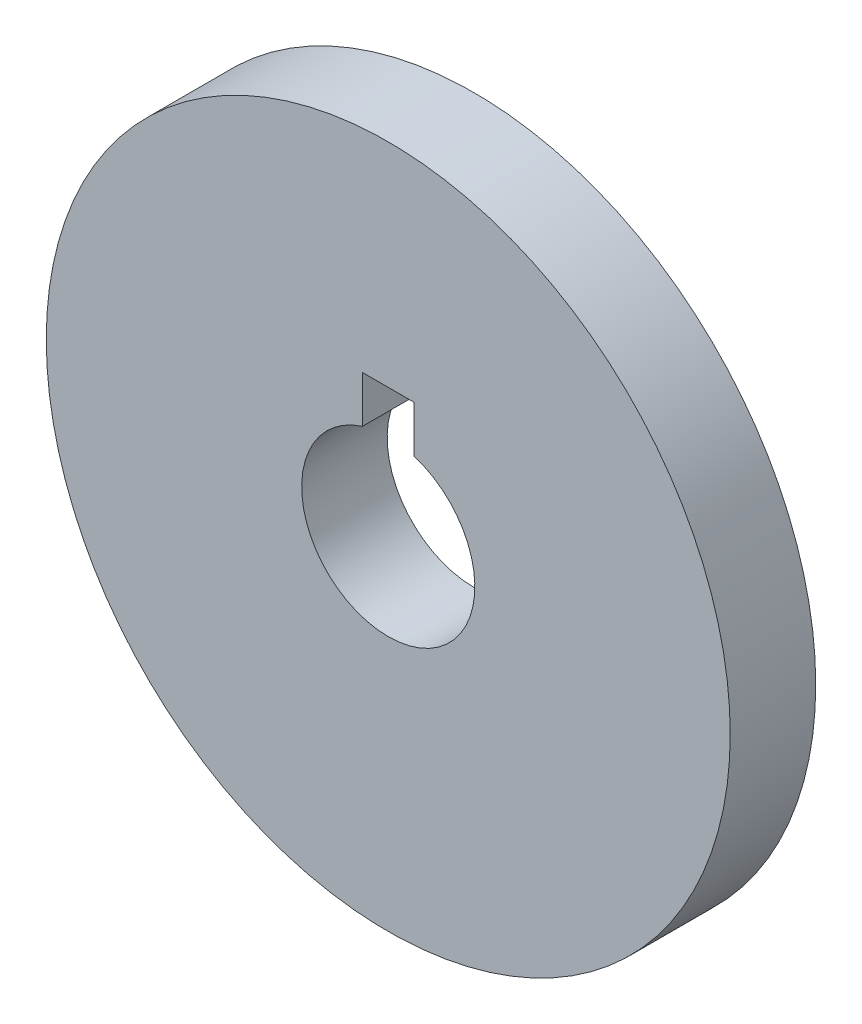
ISO-10303-21;
HEADER;
FILE_DESCRIPTION(('STEP AP214'),'2;1');
FILE_NAME('part.step','',(''),(''),'','','');
FILE_SCHEMA(('AUTOMOTIVE_DESIGN { 1 0 10303 214 1 1 1 1 }'));
ENDSEC;
DATA;
#1=APPLICATION_CONTEXT('core data for automotive mechanical design processes');
#2=APPLICATION_PROTOCOL_DEFINITION('international standard','automotive_design',2000,#1);
#3=PRODUCT_CONTEXT('',#1,'mechanical');
#4=PRODUCT('Part','Part','',(#3));
#5=PRODUCT_RELATED_PRODUCT_CATEGORY('part','',(#4));
#6=PRODUCT_DEFINITION_FORMATION('','',#4);
#7=PRODUCT_DEFINITION_CONTEXT('part definition',#1,'design');
#8=PRODUCT_DEFINITION('design','',#6,#7);
#9=PRODUCT_DEFINITION_SHAPE('','',#8);
#10=(LENGTH_UNIT() NAMED_UNIT(*) SI_UNIT(.MILLI.,.METRE.));
#11=(NAMED_UNIT(*) PLANE_ANGLE_UNIT() SI_UNIT($,.RADIAN.));
#12=(NAMED_UNIT(*) SI_UNIT($,.STERADIAN.) SOLID_ANGLE_UNIT());
#13=UNCERTAINTY_MEASURE_WITH_UNIT(LENGTH_MEASURE(1.E-05),#10,'distance_accuracy_value','');
#14=(GEOMETRIC_REPRESENTATION_CONTEXT(3) GLOBAL_UNCERTAINTY_ASSIGNED_CONTEXT((#13)) GLOBAL_UNIT_ASSIGNED_CONTEXT((#10,
#11,#12)) REPRESENTATION_CONTEXT('',''));
#15=CARTESIAN_POINT('',(0.,0.,0.));
#16=DIRECTION('',(0.,0.,1.));
#17=DIRECTION('',(1.,0.,0.));
#18=AXIS2_PLACEMENT_3D('',#15,#16,#17);
#19=CARTESIAN_POINT('',(0.,0.,10.));
#20=DIRECTION('',(0.,0.,1.));
#21=DIRECTION('',(1.,0.,0.));
#22=AXIS2_PLACEMENT_3D('',#19,#20,#21);
#23=PLANE('',#22);
#24=DIRECTION('',(0.,-1.,0.));
#25=VECTOR('',#24,1.);
#26=CARTESIAN_POINT('',(-3.025,5.125,10.));
#27=LINE('',#26,#25);
#28=CARTESIAN_POINT('',(-3.025,15.125,10.));
#29=VERTEX_POINT('',#28);
#30=CARTESIAN_POINT('',(-3.025,9.66255659750565,10.));
#31=VERTEX_POINT('',#30);
#32=EDGE_CURVE('E105',#29,#31,#27,.T.);
#33=ORIENTED_EDGE('',*,*,#32,.F.);
#34=DIRECTION('',(-1.,0.,0.));
#35=VECTOR('',#34,1.);
#36=CARTESIAN_POINT('',(3.025,15.125,10.));
#37=LINE('',#36,#35);
#38=CARTESIAN_POINT('',(3.025,15.125,10.));
#39=VERTEX_POINT('',#38);
#40=EDGE_CURVE('E102',#39,#29,#37,.T.);
#41=ORIENTED_EDGE('',*,*,#40,.F.);
#42=DIRECTION('',(0.,1.,0.));
#43=VECTOR('',#42,1.);
#44=CARTESIAN_POINT('',(3.025,5.125,10.));
#45=LINE('',#44,#43);
#46=CARTESIAN_POINT('',(3.025,9.66255659750565,10.));
#47=VERTEX_POINT('',#46);
#48=EDGE_CURVE('E85',#47,#39,#45,.T.);
#49=ORIENTED_EDGE('',*,*,#48,.F.);
#50=CARTESIAN_POINT('',(0.,0.,10.));
#51=DIRECTION('',(0.,0.,1.));
#52=DIRECTION('',(1.,0.,0.));
#53=AXIS2_PLACEMENT_3D('',#50,#51,#52);
#54=CIRCLE('',#53,10.125);
#55=EDGE_CURVE('E110',#31,#47,#54,.T.);
#56=ORIENTED_EDGE('',*,*,#55,.F.);
#57=EDGE_LOOP('',(#33,#41,#49,#56));
#58=FACE_BOUND('',#57,.T.);
#59=CARTESIAN_POINT('',(0.,0.,10.));
#60=DIRECTION('',(0.,0.,1.));
#61=DIRECTION('',(1.,0.,0.));
#62=AXIS2_PLACEMENT_3D('',#59,#60,#61);
#63=CIRCLE('',#62,40.);
#64=CARTESIAN_POINT('',(40.,0.,10.));
#65=VERTEX_POINT('',#64);
#66=EDGE_CURVE('E115',#65,#65,#63,.T.);
#67=ORIENTED_EDGE('',*,*,#66,.T.);
#68=EDGE_LOOP('',(#67));
#69=FACE_BOUND('',#68,.T.);
#70=ADVANCED_FACE('F43',(#58,#69),#23,.T.);
#71=CARTESIAN_POINT('',(0.,0.,0.));
#72=DIRECTION('',(0.,0.,1.));
#73=DIRECTION('',(1.,0.,0.));
#74=AXIS2_PLACEMENT_3D('',#71,#72,#73);
#75=PLANE('',#74);
#76=CARTESIAN_POINT('',(0.,0.,0.));
#77=DIRECTION('',(0.,0.,1.));
#78=DIRECTION('',(1.,0.,0.));
#79=AXIS2_PLACEMENT_3D('',#76,#77,#78);
#80=CIRCLE('',#79,40.);
#81=CARTESIAN_POINT('',(40.,0.,0.));
#82=VERTEX_POINT('',#81);
#83=EDGE_CURVE('E113',#82,#82,#80,.T.);
#84=ORIENTED_EDGE('',*,*,#83,.F.);
#85=EDGE_LOOP('',(#84));
#86=FACE_BOUND('',#85,.T.);
#87=DIRECTION('',(-1.,0.,0.));
#88=VECTOR('',#87,1.);
#89=CARTESIAN_POINT('',(3.025,15.125,0.));
#90=LINE('',#89,#88);
#91=CARTESIAN_POINT('',(3.025,15.125,0.));
#92=VERTEX_POINT('',#91);
#93=CARTESIAN_POINT('',(-3.025,15.125,0.));
#94=VERTEX_POINT('',#93);
#95=EDGE_CURVE('E90',#92,#94,#90,.T.);
#96=ORIENTED_EDGE('',*,*,#95,.T.);
#97=DIRECTION('',(0.,-1.,0.));
#98=VECTOR('',#97,1.);
#99=CARTESIAN_POINT('',(-3.025,5.125,0.));
#100=LINE('',#99,#98);
#101=CARTESIAN_POINT('',(-3.025,9.66255659750565,0.));
#102=VERTEX_POINT('',#101);
#103=EDGE_CURVE('E100',#94,#102,#100,.T.);
#104=ORIENTED_EDGE('',*,*,#103,.T.);
#105=CARTESIAN_POINT('',(0.,0.,0.));
#106=DIRECTION('',(0.,0.,1.));
#107=DIRECTION('',(1.,0.,0.));
#108=AXIS2_PLACEMENT_3D('',#105,#106,#107);
#109=CIRCLE('',#108,10.125);
#110=CARTESIAN_POINT('',(3.025,9.66255659750565,0.));
#111=VERTEX_POINT('',#110);
#112=EDGE_CURVE('E99',#102,#111,#109,.T.);
#113=ORIENTED_EDGE('',*,*,#112,.T.);
#114=DIRECTION('',(0.,1.,0.));
#115=VECTOR('',#114,1.);
#116=CARTESIAN_POINT('',(3.025,5.125,0.));
#117=LINE('',#116,#115);
#118=EDGE_CURVE('E58',#111,#92,#117,.T.);
#119=ORIENTED_EDGE('',*,*,#118,.T.);
#120=EDGE_LOOP('',(#96,#104,#113,#119));
#121=FACE_BOUND('',#120,.T.);
#122=ADVANCED_FACE('F97',(#86,#121),#75,.F.);
#123=CARTESIAN_POINT('',(0.,0.,10.));
#124=DIRECTION('',(0.,0.,-1.));
#125=DIRECTION('',(-1.,0.,0.));
#126=AXIS2_PLACEMENT_3D('',#123,#124,#125);
#127=CYLINDRICAL_SURFACE('',#126,40.);
#128=ORIENTED_EDGE('',*,*,#66,.F.);
#129=EDGE_LOOP('',(#128));
#130=FACE_BOUND('',#129,.T.);
#131=ORIENTED_EDGE('',*,*,#83,.T.);
#132=EDGE_LOOP('',(#131));
#133=FACE_BOUND('',#132,.T.);
#134=ADVANCED_FACE('F45',(#130,#133),#127,.T.);
#135=CARTESIAN_POINT('',(0.,0.,10.));
#136=DIRECTION('',(0.,0.,-1.));
#137=DIRECTION('',(-1.,0.,0.));
#138=AXIS2_PLACEMENT_3D('',#135,#136,#137);
#139=CYLINDRICAL_SURFACE('',#138,10.125);
#140=DIRECTION('',(0.,0.,-1.));
#141=VECTOR('',#140,1.);
#142=CARTESIAN_POINT('',(-3.025,9.66255659750565,10.));
#143=LINE('',#142,#141);
#144=EDGE_CURVE('E11',#31,#102,#143,.T.);
#145=ORIENTED_EDGE('',*,*,#144,.F.);
#146=ORIENTED_EDGE('',*,*,#55,.T.);
#147=DIRECTION('',(0.,0.,-1.));
#148=VECTOR('',#147,1.);
#149=CARTESIAN_POINT('',(3.025,9.66255659750565,10.));
#150=LINE('',#149,#148);
#151=EDGE_CURVE('E51',#111,#47,#150,.F.);
#152=ORIENTED_EDGE('',*,*,#151,.F.);
#153=ORIENTED_EDGE('',*,*,#112,.F.);
#154=EDGE_LOOP('',(#145,#146,#152,#153));
#155=FACE_BOUND('',#154,.T.);
#156=ADVANCED_FACE('F124',(#155),#139,.F.);
#157=CARTESIAN_POINT('',(-3.025,5.125,0.));
#158=DIRECTION('',(-1.,0.,0.));
#159=DIRECTION('',(0.,0.,1.));
#160=AXIS2_PLACEMENT_3D('',#157,#158,#159);
#161=PLANE('',#160);
#162=ORIENTED_EDGE('',*,*,#144,.T.);
#163=ORIENTED_EDGE('',*,*,#103,.F.);
#164=DIRECTION('',(0.,0.,1.));
#165=VECTOR('',#164,1.);
#166=CARTESIAN_POINT('',(-3.025,15.125,0.));
#167=LINE('',#166,#165);
#168=EDGE_CURVE('E89',#94,#29,#167,.T.);
#169=ORIENTED_EDGE('',*,*,#168,.T.);
#170=ORIENTED_EDGE('',*,*,#32,.T.);
#171=EDGE_LOOP('',(#162,#163,#169,#170));
#172=FACE_BOUND('',#171,.T.);
#173=ADVANCED_FACE('F126',(#172),#161,.F.);
#174=CARTESIAN_POINT('',(3.025,15.125,0.));
#175=DIRECTION('',(0.,1.,0.));
#176=DIRECTION('',(0.,0.,1.));
#177=AXIS2_PLACEMENT_3D('',#174,#175,#176);
#178=PLANE('',#177);
#179=ORIENTED_EDGE('',*,*,#40,.T.);
#180=ORIENTED_EDGE('',*,*,#168,.F.);
#181=ORIENTED_EDGE('',*,*,#95,.F.);
#182=DIRECTION('',(0.,0.,1.));
#183=VECTOR('',#182,1.);
#184=CARTESIAN_POINT('',(3.025,15.125,0.));
#185=LINE('',#184,#183);
#186=EDGE_CURVE('E81',#92,#39,#185,.T.);
#187=ORIENTED_EDGE('',*,*,#186,.T.);
#188=EDGE_LOOP('',(#179,#180,#181,#187));
#189=FACE_BOUND('',#188,.T.);
#190=ADVANCED_FACE('F93',(#189),#178,.F.);
#191=CARTESIAN_POINT('',(3.025,5.125,0.));
#192=DIRECTION('',(1.,0.,0.));
#193=DIRECTION('',(0.,0.,-1.));
#194=AXIS2_PLACEMENT_3D('',#191,#192,#193);
#195=PLANE('',#194);
#196=ORIENTED_EDGE('',*,*,#151,.T.);
#197=ORIENTED_EDGE('',*,*,#48,.T.);
#198=ORIENTED_EDGE('',*,*,#186,.F.);
#199=ORIENTED_EDGE('',*,*,#118,.F.);
#200=EDGE_LOOP('',(#196,#197,#198,#199));
#201=FACE_BOUND('',#200,.T.);
#202=ADVANCED_FACE('F83',(#201),#195,.F.);
#203=CLOSED_SHELL('',(#70,#122,#134,#156,#173,#190,#202));
#204=MANIFOLD_SOLID_BREP('B2',#203);
#205=ADVANCED_BREP_SHAPE_REPRESENTATION('',(#18,#204),#14);
#206=SHAPE_DEFINITION_REPRESENTATION(#9,#205);
ENDSEC;
END-ISO-10303-21;
